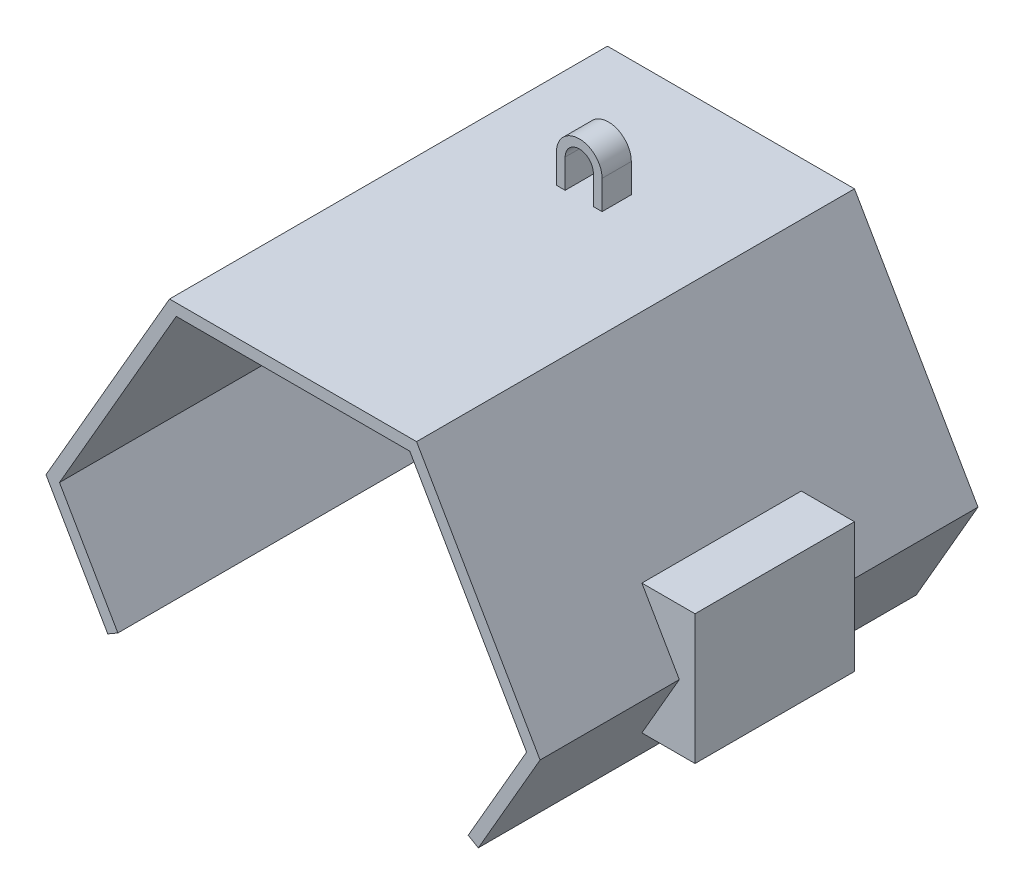
ISO-10303-21;
HEADER;
FILE_DESCRIPTION(('STEP AP214'),'2;1');
FILE_NAME('part.step','',(''),(''),'','','');
FILE_SCHEMA(('AUTOMOTIVE_DESIGN { 1 0 10303 214 1 1 1 1 }'));
ENDSEC;
DATA;
#1=APPLICATION_CONTEXT('core data for automotive mechanical design processes');
#2=APPLICATION_PROTOCOL_DEFINITION('international standard','automotive_design',2000,#1);
#3=PRODUCT_CONTEXT('',#1,'mechanical');
#4=PRODUCT('Part','Part','',(#3));
#5=PRODUCT_RELATED_PRODUCT_CATEGORY('part','',(#4));
#6=PRODUCT_DEFINITION_FORMATION('','',#4);
#7=PRODUCT_DEFINITION_CONTEXT('part definition',#1,'design');
#8=PRODUCT_DEFINITION('design','',#6,#7);
#9=PRODUCT_DEFINITION_SHAPE('','',#8);
#10=(LENGTH_UNIT() NAMED_UNIT(*) SI_UNIT(.MILLI.,.METRE.));
#11=(NAMED_UNIT(*) PLANE_ANGLE_UNIT() SI_UNIT($,.RADIAN.));
#12=(NAMED_UNIT(*) SI_UNIT($,.STERADIAN.) SOLID_ANGLE_UNIT());
#13=UNCERTAINTY_MEASURE_WITH_UNIT(LENGTH_MEASURE(1.E-05),#10,'distance_accuracy_value','');
#14=(GEOMETRIC_REPRESENTATION_CONTEXT(3) GLOBAL_UNCERTAINTY_ASSIGNED_CONTEXT((#13)) GLOBAL_UNIT_ASSIGNED_CONTEXT((#10,
#11,#12)) REPRESENTATION_CONTEXT('',''));
#15=CARTESIAN_POINT('',(0.,0.,0.));
#16=DIRECTION('',(0.,0.,1.));
#17=DIRECTION('',(1.,0.,0.));
#18=AXIS2_PLACEMENT_3D('',#15,#16,#17);
#19=CARTESIAN_POINT('',(-42.3094010767585,73.2820323027551,150.));
#20=DIRECTION('',(0.866025403784439,-0.5,0.));
#21=DIRECTION('',(0.5,0.866025403784439,0.));
#22=AXIS2_PLACEMENT_3D('',#19,#20,#21);
#23=PLANE('',#22);
#24=DIRECTION('',(0.5,0.866025403784439,0.));
#25=VECTOR('',#24,1.);
#26=CARTESIAN_POINT('',(-42.3094010767585,73.2820323027551,102.30182397601));
#27=LINE('',#26,#25);
#28=CARTESIAN_POINT('',(-84.618802153517,0.,102.30182397601));
#29=VERTEX_POINT('',#28);
#30=CARTESIAN_POINT('',(-71.792278819996,22.2161900981261,102.30182397601));
#31=VERTEX_POINT('',#30);
#32=EDGE_CURVE('E330',#29,#31,#27,.T.);
#33=ORIENTED_EDGE('',*,*,#32,.F.);
#34=DIRECTION('',(0.,0.,-1.));
#35=VECTOR('',#34,1.);
#36=CARTESIAN_POINT('',(-84.618802153517,0.,150.));
#37=LINE('',#36,#35);
#38=CARTESIAN_POINT('',(-84.618802153517,0.,150.));
#39=VERTEX_POINT('',#38);
#40=EDGE_CURVE('E40',#39,#29,#37,.T.);
#41=ORIENTED_EDGE('',*,*,#40,.F.);
#42=DIRECTION('',(-0.5,-0.866025403784439,0.));
#43=VECTOR('',#42,1.);
#44=CARTESIAN_POINT('',(-42.3094010767585,73.2820323027551,150.));
#45=LINE('',#44,#43);
#46=CARTESIAN_POINT('',(-42.3094010767585,73.2820323027551,150.));
#47=VERTEX_POINT('',#46);
#48=EDGE_CURVE('E379',#47,#39,#45,.T.);
#49=ORIENTED_EDGE('',*,*,#48,.F.);
#50=DIRECTION('',(0.,0.,-1.));
#51=VECTOR('',#50,1.);
#52=CARTESIAN_POINT('',(-42.3094010767585,73.2820323027551,150.));
#53=LINE('',#52,#51);
#54=CARTESIAN_POINT('',(-42.3094010767585,73.2820323027551,0.));
#55=VERTEX_POINT('',#54);
#56=EDGE_CURVE('E11',#47,#55,#53,.T.);
#57=ORIENTED_EDGE('',*,*,#56,.T.);
#58=DIRECTION('',(-0.5,-0.866025403784439,0.));
#59=VECTOR('',#58,1.);
#60=CARTESIAN_POINT('',(-42.3094010767585,73.2820323027551,0.));
#61=LINE('',#60,#59);
#62=CARTESIAN_POINT('',(-84.618802153517,0.,0.));
#63=VERTEX_POINT('',#62);
#64=EDGE_CURVE('E405',#55,#63,#61,.T.);
#65=ORIENTED_EDGE('',*,*,#64,.T.);
#66=CARTESIAN_POINT('',(-84.618802153517,0.,47.6981760239895));
#67=VERTEX_POINT('',#66);
#68=EDGE_CURVE('E457',#67,#63,#37,.T.);
#69=ORIENTED_EDGE('',*,*,#68,.F.);
#70=DIRECTION('',(-0.5,-0.866025403784439,0.));
#71=VECTOR('',#70,1.);
#72=CARTESIAN_POINT('',(-42.3094010767585,73.2820323027551,47.6981760239896));
#73=LINE('',#72,#71);
#74=CARTESIAN_POINT('',(-71.792278819996,22.2161900981261,47.6981760239895));
#75=VERTEX_POINT('',#74);
#76=EDGE_CURVE('E324',#75,#67,#73,.T.);
#77=ORIENTED_EDGE('',*,*,#76,.F.);
#78=DIRECTION('',(0.,0.,-1.));
#79=VECTOR('',#78,1.);
#80=CARTESIAN_POINT('',(-71.792278819996,22.2161900981261,150.));
#81=LINE('',#80,#79);
#82=EDGE_CURVE('E336',#31,#75,#81,.T.);
#83=ORIENTED_EDGE('',*,*,#82,.F.);
#84=EDGE_LOOP('',(#33,#41,#49,#57,#65,#69,#77,#83));
#85=FACE_BOUND('',#84,.T.);
#86=ADVANCED_FACE('F32',(#85),#23,.F.);
#87=CARTESIAN_POINT('',(-84.618802153517,0.,150.));
#88=DIRECTION('',(0.866025403784438,0.5,0.));
#89=DIRECTION('',(-0.5,0.866025403784439,0.));
#90=AXIS2_PLACEMENT_3D('',#87,#88,#89);
#91=PLANE('',#90);
#92=DIRECTION('',(-0.5,0.866025403784439,0.));
#93=VECTOR('',#92,1.);
#94=CARTESIAN_POINT('',(-84.618802153517,0.,102.30182397601));
#95=LINE('',#94,#93);
#96=CARTESIAN_POINT('',(-71.792278819996,-22.2161900981261,102.30182397601));
#97=VERTEX_POINT('',#96);
#98=EDGE_CURVE('E327',#97,#29,#95,.T.);
#99=ORIENTED_EDGE('',*,*,#98,.F.);
#100=DIRECTION('',(0.,0.,1.));
#101=VECTOR('',#100,1.);
#102=CARTESIAN_POINT('',(-71.792278819996,-22.2161900981261,150.));
#103=LINE('',#102,#101);
#104=CARTESIAN_POINT('',(-71.7922788199959,-22.2161900981261,47.6981760239895));
#105=VERTEX_POINT('',#104);
#106=EDGE_CURVE('E333',#105,#97,#103,.T.);
#107=ORIENTED_EDGE('',*,*,#106,.F.);
#108=DIRECTION('',(0.5,-0.866025403784439,0.));
#109=VECTOR('',#108,1.);
#110=CARTESIAN_POINT('',(-84.618802153517,0.,47.6981760239895));
#111=LINE('',#110,#109);
#112=EDGE_CURVE('E316',#67,#105,#111,.T.);
#113=ORIENTED_EDGE('',*,*,#112,.F.);
#114=ORIENTED_EDGE('',*,*,#68,.T.);
#115=DIRECTION('',(0.5,-0.866025403784438,0.));
#116=VECTOR('',#115,1.);
#117=CARTESIAN_POINT('',(-84.618802153517,0.,0.));
#118=LINE('',#117,#116);
#119=CARTESIAN_POINT('',(-63.4641016151377,-36.6410161513775,0.));
#120=VERTEX_POINT('',#119);
#121=EDGE_CURVE('E408',#63,#120,#118,.T.);
#122=ORIENTED_EDGE('',*,*,#121,.T.);
#123=DIRECTION('',(0.,0.,-1.));
#124=VECTOR('',#123,1.);
#125=CARTESIAN_POINT('',(-63.4641016151377,-36.6410161513775,150.));
#126=LINE('',#125,#124);
#127=CARTESIAN_POINT('',(-63.4641016151377,-36.6410161513775,150.));
#128=VERTEX_POINT('',#127);
#129=EDGE_CURVE('E455',#128,#120,#126,.T.);
#130=ORIENTED_EDGE('',*,*,#129,.F.);
#131=DIRECTION('',(0.5,-0.866025403784438,0.));
#132=VECTOR('',#131,1.);
#133=CARTESIAN_POINT('',(-84.618802153517,0.,150.));
#134=LINE('',#133,#132);
#135=EDGE_CURVE('E382',#39,#128,#134,.T.);
#136=ORIENTED_EDGE('',*,*,#135,.F.);
#137=ORIENTED_EDGE('',*,*,#40,.T.);
#138=EDGE_LOOP('',(#99,#107,#113,#114,#122,#130,#136,#137));
#139=FACE_BOUND('',#138,.T.);
#140=ADVANCED_FACE('F463',(#139),#91,.F.);
#141=CARTESIAN_POINT('',(-80.,0.,150.));
#142=DIRECTION('',(-0.866025403784438,-0.5,0.));
#143=DIRECTION('',(0.5,-0.866025403784439,0.));
#144=AXIS2_PLACEMENT_3D('',#141,#142,#143);
#145=PLANE('',#144);
#146=DIRECTION('',(-0.5,0.866025403784438,0.));
#147=VECTOR('',#146,1.);
#148=CARTESIAN_POINT('',(-80.,0.,0.));
#149=LINE('',#148,#147);
#150=CARTESIAN_POINT('',(-60.,-34.6410161513775,0.));
#151=VERTEX_POINT('',#150);
#152=CARTESIAN_POINT('',(-80.,0.,0.));
#153=VERTEX_POINT('',#152);
#154=EDGE_CURVE('E412',#151,#153,#149,.T.);
#155=ORIENTED_EDGE('',*,*,#154,.T.);
#156=DIRECTION('',(0.,0.,-1.));
#157=VECTOR('',#156,1.);
#158=CARTESIAN_POINT('',(-80.,0.,150.));
#159=LINE('',#158,#157);
#160=CARTESIAN_POINT('',(-80.,0.,150.));
#161=VERTEX_POINT('',#160);
#162=EDGE_CURVE('E450',#161,#153,#159,.T.);
#163=ORIENTED_EDGE('',*,*,#162,.F.);
#164=DIRECTION('',(-0.5,0.866025403784438,0.));
#165=VECTOR('',#164,1.);
#166=CARTESIAN_POINT('',(-80.,0.,150.));
#167=LINE('',#166,#165);
#168=CARTESIAN_POINT('',(-60.,-34.6410161513775,150.));
#169=VERTEX_POINT('',#168);
#170=EDGE_CURVE('E386',#169,#161,#167,.T.);
#171=ORIENTED_EDGE('',*,*,#170,.F.);
#172=DIRECTION('',(0.,0.,-1.));
#173=VECTOR('',#172,1.);
#174=CARTESIAN_POINT('',(-60.,-34.6410161513775,150.));
#175=LINE('',#174,#173);
#176=EDGE_CURVE('E452',#169,#151,#175,.T.);
#177=ORIENTED_EDGE('',*,*,#176,.T.);
#178=EDGE_LOOP('',(#155,#163,#171,#177));
#179=FACE_BOUND('',#178,.T.);
#180=ADVANCED_FACE('F480',(#179),#145,.F.);
#181=CARTESIAN_POINT('',(-40.,69.2820323027551,150.));
#182=DIRECTION('',(-0.866025403784439,0.5,0.));
#183=DIRECTION('',(-0.5,-0.866025403784439,0.));
#184=AXIS2_PLACEMENT_3D('',#181,#182,#183);
#185=PLANE('',#184);
#186=ORIENTED_EDGE('',*,*,#162,.T.);
#187=DIRECTION('',(0.5,0.866025403784439,0.));
#188=VECTOR('',#187,1.);
#189=CARTESIAN_POINT('',(-40.,69.2820323027551,0.));
#190=LINE('',#189,#188);
#191=CARTESIAN_POINT('',(-40.,69.2820323027551,0.));
#192=VERTEX_POINT('',#191);
#193=EDGE_CURVE('E415',#153,#192,#190,.T.);
#194=ORIENTED_EDGE('',*,*,#193,.T.);
#195=DIRECTION('',(0.,0.,-1.));
#196=VECTOR('',#195,1.);
#197=CARTESIAN_POINT('',(-40.,69.2820323027551,150.));
#198=LINE('',#197,#196);
#199=CARTESIAN_POINT('',(-40.,69.2820323027551,150.));
#200=VERTEX_POINT('',#199);
#201=EDGE_CURVE('E447',#200,#192,#198,.T.);
#202=ORIENTED_EDGE('',*,*,#201,.F.);
#203=DIRECTION('',(0.5,0.866025403784439,0.));
#204=VECTOR('',#203,1.);
#205=CARTESIAN_POINT('',(-40.,69.2820323027551,150.));
#206=LINE('',#205,#204);
#207=EDGE_CURVE('E388',#161,#200,#206,.T.);
#208=ORIENTED_EDGE('',*,*,#207,.F.);
#209=EDGE_LOOP('',(#186,#194,#202,#208));
#210=FACE_BOUND('',#209,.T.);
#211=ADVANCED_FACE('F527',(#210),#185,.F.);
#212=CARTESIAN_POINT('',(80.,0.,150.));
#213=DIRECTION('',(0.866025403784438,0.5,0.));
#214=DIRECTION('',(-0.5,0.866025403784439,0.));
#215=AXIS2_PLACEMENT_3D('',#212,#213,#214);
#216=PLANE('',#215);
#217=DIRECTION('',(0.5,-0.866025403784439,0.));
#218=VECTOR('',#217,1.);
#219=CARTESIAN_POINT('',(80.,0.,0.));
#220=LINE('',#219,#218);
#221=CARTESIAN_POINT('',(39.9999999999999,69.2820323027551,0.));
#222=VERTEX_POINT('',#221);
#223=CARTESIAN_POINT('',(80.,0.,0.));
#224=VERTEX_POINT('',#223);
#225=EDGE_CURVE('E419',#222,#224,#220,.T.);
#226=ORIENTED_EDGE('',*,*,#225,.T.);
#227=DIRECTION('',(0.,0.,-1.));
#228=VECTOR('',#227,1.);
#229=CARTESIAN_POINT('',(80.,0.,150.));
#230=LINE('',#229,#228);
#231=CARTESIAN_POINT('',(80.,0.,150.));
#232=VERTEX_POINT('',#231);
#233=EDGE_CURVE('E442',#232,#224,#230,.T.);
#234=ORIENTED_EDGE('',*,*,#233,.F.);
#235=DIRECTION('',(0.5,-0.866025403784439,0.));
#236=VECTOR('',#235,1.);
#237=CARTESIAN_POINT('',(80.,0.,150.));
#238=LINE('',#237,#236);
#239=CARTESIAN_POINT('',(39.9999999999999,69.2820323027551,150.));
#240=VERTEX_POINT('',#239);
#241=EDGE_CURVE('E392',#240,#232,#238,.T.);
#242=ORIENTED_EDGE('',*,*,#241,.F.);
#243=DIRECTION('',(0.,0.,-1.));
#244=VECTOR('',#243,1.);
#245=CARTESIAN_POINT('',(39.9999999999999,69.2820323027551,150.));
#246=LINE('',#245,#244);
#247=EDGE_CURVE('E444',#240,#222,#246,.T.);
#248=ORIENTED_EDGE('',*,*,#247,.T.);
#249=EDGE_LOOP('',(#226,#234,#242,#248));
#250=FACE_BOUND('',#249,.T.);
#251=ADVANCED_FACE('F530',(#250),#216,.F.);
#252=CARTESIAN_POINT('',(60.,-34.6410161513775,150.));
#253=DIRECTION('',(0.866025403784439,-0.5,0.));
#254=DIRECTION('',(0.5,0.866025403784439,0.));
#255=AXIS2_PLACEMENT_3D('',#252,#253,#254);
#256=PLANE('',#255);
#257=ORIENTED_EDGE('',*,*,#233,.T.);
#258=DIRECTION('',(-0.5,-0.866025403784439,0.));
#259=VECTOR('',#258,1.);
#260=CARTESIAN_POINT('',(60.,-34.6410161513775,0.));
#261=LINE('',#260,#259);
#262=CARTESIAN_POINT('',(60.,-34.6410161513775,0.));
#263=VERTEX_POINT('',#262);
#264=EDGE_CURVE('E422',#224,#263,#261,.T.);
#265=ORIENTED_EDGE('',*,*,#264,.T.);
#266=DIRECTION('',(0.,0.,-1.));
#267=VECTOR('',#266,1.);
#268=CARTESIAN_POINT('',(60.,-34.6410161513775,150.));
#269=LINE('',#268,#267);
#270=CARTESIAN_POINT('',(60.,-34.6410161513775,150.));
#271=VERTEX_POINT('',#270);
#272=EDGE_CURVE('E439',#271,#263,#269,.T.);
#273=ORIENTED_EDGE('',*,*,#272,.F.);
#274=DIRECTION('',(-0.5,-0.866025403784439,0.));
#275=VECTOR('',#274,1.);
#276=CARTESIAN_POINT('',(60.,-34.6410161513775,150.));
#277=LINE('',#276,#275);
#278=EDGE_CURVE('E394',#232,#271,#277,.T.);
#279=ORIENTED_EDGE('',*,*,#278,.F.);
#280=EDGE_LOOP('',(#257,#265,#273,#279));
#281=FACE_BOUND('',#280,.T.);
#282=ADVANCED_FACE('F538',(#281),#256,.F.);
#283=CARTESIAN_POINT('',(90.,0.,0.));
#284=DIRECTION('',(1.,0.,0.));
#285=DIRECTION('',(0.,0.,-1.));
#286=AXIS2_PLACEMENT_3D('',#283,#284,#285);
#287=PLANE('',#286);
#288=DIRECTION('',(0.,-1.,0.));
#289=VECTOR('',#288,1.);
#290=CARTESIAN_POINT('',(90.,22.2161900981261,102.30182397601));
#291=LINE('',#290,#289);
#292=CARTESIAN_POINT('',(90.,22.2161900981261,102.30182397601));
#293=VERTEX_POINT('',#292);
#294=CARTESIAN_POINT('',(90.,-22.2161900981261,102.30182397601));
#295=VERTEX_POINT('',#294);
#296=EDGE_CURVE('E364',#293,#295,#291,.T.);
#297=ORIENTED_EDGE('',*,*,#296,.T.);
#298=DIRECTION('',(0.,0.,1.));
#299=VECTOR('',#298,1.);
#300=CARTESIAN_POINT('',(90.,-22.2161900981261,32.8075250499135));
#301=LINE('',#300,#299);
#302=CARTESIAN_POINT('',(90.,-22.2161900981261,47.6981760239895));
#303=VERTEX_POINT('',#302);
#304=EDGE_CURVE('E287',#303,#295,#301,.T.);
#305=ORIENTED_EDGE('',*,*,#304,.F.);
#306=DIRECTION('',(0.,-1.,0.));
#307=VECTOR('',#306,1.);
#308=CARTESIAN_POINT('',(90.,22.2161900981261,47.6981760239895));
#309=LINE('',#308,#307);
#310=CARTESIAN_POINT('',(90.,22.2161900981261,47.6981760239895));
#311=VERTEX_POINT('',#310);
#312=EDGE_CURVE('E361',#311,#303,#309,.T.);
#313=ORIENTED_EDGE('',*,*,#312,.F.);
#314=DIRECTION('',(0.,0.,1.));
#315=VECTOR('',#314,1.);
#316=CARTESIAN_POINT('',(90.,22.2161900981261,102.30182397601));
#317=LINE('',#316,#315);
#318=EDGE_CURVE('E339',#311,#293,#317,.T.);
#319=ORIENTED_EDGE('',*,*,#318,.T.);
#320=EDGE_LOOP('',(#297,#305,#313,#319));
#321=FACE_BOUND('',#320,.T.);
#322=ADVANCED_FACE('F542',(#321),#287,.T.);
#323=CARTESIAN_POINT('',(63.4641016151378,-36.6410161513776,150.));
#324=DIRECTION('',(-0.866025403784439,0.5,0.));
#325=DIRECTION('',(-0.5,-0.866025403784439,0.));
#326=AXIS2_PLACEMENT_3D('',#323,#324,#325);
#327=PLANE('',#326);
#328=DIRECTION('',(-0.5,-0.866025403784439,0.));
#329=VECTOR('',#328,1.);
#330=CARTESIAN_POINT('',(75.2780285621825,-16.178694442189,47.6981760239895));
#331=LINE('',#330,#329);
#332=CARTESIAN_POINT('',(84.618802153517,0.,47.6981760239895));
#333=VERTEX_POINT('',#332);
#334=CARTESIAN_POINT('',(71.792278819996,-22.2161900981261,47.6981760239895));
#335=VERTEX_POINT('',#334);
#336=EDGE_CURVE('E357',#333,#335,#331,.T.);
#337=ORIENTED_EDGE('',*,*,#336,.T.);
#338=DIRECTION('',(0.,0.,-1.));
#339=VECTOR('',#338,1.);
#340=CARTESIAN_POINT('',(71.792278819996,-22.2161900981261,102.30182397601));
#341=LINE('',#340,#339);
#342=CARTESIAN_POINT('',(71.792278819996,-22.2161900981261,102.30182397601));
#343=VERTEX_POINT('',#342);
#344=EDGE_CURVE('E365',#343,#335,#341,.T.);
#345=ORIENTED_EDGE('',*,*,#344,.F.);
#346=DIRECTION('',(-0.5,-0.866025403784439,0.));
#347=VECTOR('',#346,1.);
#348=CARTESIAN_POINT('',(75.2780285621825,-16.178694442189,102.30182397601));
#349=LINE('',#348,#347);
#350=CARTESIAN_POINT('',(84.618802153517,0.,102.30182397601));
#351=VERTEX_POINT('',#350);
#352=EDGE_CURVE('E358',#351,#343,#349,.T.);
#353=ORIENTED_EDGE('',*,*,#352,.F.);
#354=DIRECTION('',(0.,0.,-1.));
#355=VECTOR('',#354,1.);
#356=CARTESIAN_POINT('',(84.618802153517,0.,150.));
#357=LINE('',#356,#355);
#358=CARTESIAN_POINT('',(84.618802153517,0.,150.));
#359=VERTEX_POINT('',#358);
#360=EDGE_CURVE('E433',#359,#351,#357,.T.);
#361=ORIENTED_EDGE('',*,*,#360,.F.);
#362=DIRECTION('',(0.5,0.866025403784439,0.));
#363=VECTOR('',#362,1.);
#364=CARTESIAN_POINT('',(63.4641016151378,-36.6410161513776,150.));
#365=LINE('',#364,#363);
#366=CARTESIAN_POINT('',(63.4641016151378,-36.6410161513776,150.));
#367=VERTEX_POINT('',#366);
#368=EDGE_CURVE('E398',#367,#359,#365,.T.);
#369=ORIENTED_EDGE('',*,*,#368,.F.);
#370=DIRECTION('',(0.,0.,-1.));
#371=VECTOR('',#370,1.);
#372=CARTESIAN_POINT('',(63.4641016151378,-36.6410161513776,150.));
#373=LINE('',#372,#371);
#374=CARTESIAN_POINT('',(63.4641016151378,-36.6410161513776,0.));
#375=VERTEX_POINT('',#374);
#376=EDGE_CURVE('E436',#367,#375,#373,.T.);
#377=ORIENTED_EDGE('',*,*,#376,.T.);
#378=DIRECTION('',(0.5,0.866025403784439,0.));
#379=VECTOR('',#378,1.);
#380=CARTESIAN_POINT('',(63.4641016151378,-36.6410161513776,0.));
#381=LINE('',#380,#379);
#382=CARTESIAN_POINT('',(84.618802153517,0.,0.));
#383=VERTEX_POINT('',#382);
#384=EDGE_CURVE('E426',#375,#383,#381,.T.);
#385=ORIENTED_EDGE('',*,*,#384,.T.);
#386=EDGE_CURVE('E432',#333,#383,#357,.T.);
#387=ORIENTED_EDGE('',*,*,#386,.F.);
#388=EDGE_LOOP('',(#337,#345,#353,#361,#369,#377,#385,#387));
#389=FACE_BOUND('',#388,.T.);
#390=ADVANCED_FACE('F548',(#389),#327,.F.);
#391=CARTESIAN_POINT('',(42.3094010767584,73.2820323027551,150.));
#392=DIRECTION('',(0.,-1.,0.));
#393=DIRECTION('',(1.,0.,0.));
#394=AXIS2_PLACEMENT_3D('',#391,#392,#393);
#395=PLANE('',#394);
#396=DIRECTION('',(0.,0.,1.));
#397=VECTOR('',#396,1.);
#398=CARTESIAN_POINT('',(-9.78911304963503,73.2820323027551,40.));
#399=LINE('',#398,#397);
#400=CARTESIAN_POINT('',(-9.78911304963503,73.2820323027551,40.));
#401=VERTEX_POINT('',#400);
#402=CARTESIAN_POINT('',(-9.78911304963503,73.2820323027551,50.));
#403=VERTEX_POINT('',#402);
#404=EDGE_CURVE('E47',#401,#403,#399,.T.);
#405=ORIENTED_EDGE('',*,*,#404,.F.);
#406=DIRECTION('',(1.,0.,0.));
#407=VECTOR('',#406,1.);
#408=CARTESIAN_POINT('',(-9.78911304963503,73.2820323027551,40.));
#409=LINE('',#408,#407);
#410=CARTESIAN_POINT('',(-6.78911304963503,73.2820323027551,40.));
#411=VERTEX_POINT('',#410);
#412=EDGE_CURVE('E51',#401,#411,#409,.T.);
#413=ORIENTED_EDGE('',*,*,#412,.T.);
#414=DIRECTION('',(0.,0.,1.));
#415=VECTOR('',#414,1.);
#416=CARTESIAN_POINT('',(-6.78911304963503,73.2820323027551,40.));
#417=LINE('',#416,#415);
#418=CARTESIAN_POINT('',(-6.78911304963503,73.2820323027551,50.));
#419=VERTEX_POINT('',#418);
#420=EDGE_CURVE('E238',#411,#419,#417,.T.);
#421=ORIENTED_EDGE('',*,*,#420,.T.);
#422=DIRECTION('',(1.,0.,0.));
#423=VECTOR('',#422,1.);
#424=CARTESIAN_POINT('',(-9.78911304963503,73.2820323027551,50.));
#425=LINE('',#424,#423);
#426=EDGE_CURVE('E266',#403,#419,#425,.T.);
#427=ORIENTED_EDGE('',*,*,#426,.F.);
#428=EDGE_LOOP('',(#405,#413,#421,#427));
#429=FACE_BOUND('',#428,.T.);
#430=DIRECTION('',(0.,0.,1.));
#431=VECTOR('',#430,1.);
#432=CARTESIAN_POINT('',(2.86153035932568,73.2820323027551,40.));
#433=LINE('',#432,#431);
#434=CARTESIAN_POINT('',(2.86153035932568,73.2820323027551,40.));
#435=VERTEX_POINT('',#434);
#436=CARTESIAN_POINT('',(2.86153035932568,73.2820323027551,50.));
#437=VERTEX_POINT('',#436);
#438=EDGE_CURVE('E294',#435,#437,#433,.T.);
#439=ORIENTED_EDGE('',*,*,#438,.F.);
#440=DIRECTION('',(1.,0.,0.));
#441=VECTOR('',#440,1.);
#442=CARTESIAN_POINT('',(5.86153035932568,73.2820323027551,40.));
#443=LINE('',#442,#441);
#444=CARTESIAN_POINT('',(5.86153035932568,73.2820323027551,40.));
#445=VERTEX_POINT('',#444);
#446=EDGE_CURVE('E255',#435,#445,#443,.T.);
#447=ORIENTED_EDGE('',*,*,#446,.T.);
#448=DIRECTION('',(0.,0.,1.));
#449=VECTOR('',#448,1.);
#450=CARTESIAN_POINT('',(5.86153035932568,73.2820323027551,40.));
#451=LINE('',#450,#449);
#452=CARTESIAN_POINT('',(5.86153035932568,73.2820323027551,50.));
#453=VERTEX_POINT('',#452);
#454=EDGE_CURVE('E292',#445,#453,#451,.T.);
#455=ORIENTED_EDGE('',*,*,#454,.T.);
#456=DIRECTION('',(1.,0.,0.));
#457=VECTOR('',#456,1.);
#458=CARTESIAN_POINT('',(5.86153035932568,73.2820323027551,50.));
#459=LINE('',#458,#457);
#460=EDGE_CURVE('E275',#437,#453,#459,.T.);
#461=ORIENTED_EDGE('',*,*,#460,.F.);
#462=EDGE_LOOP('',(#439,#447,#455,#461));
#463=FACE_BOUND('',#462,.T.);
#464=DIRECTION('',(-1.,0.,0.));
#465=VECTOR('',#464,1.);
#466=CARTESIAN_POINT('',(42.3094010767584,73.2820323027551,0.));
#467=LINE('',#466,#465);
#468=CARTESIAN_POINT('',(42.3094010767584,73.2820323027551,0.));
#469=VERTEX_POINT('',#468);
#470=EDGE_CURVE('E373',#469,#55,#467,.T.);
#471=ORIENTED_EDGE('',*,*,#470,.T.);
#472=ORIENTED_EDGE('',*,*,#56,.F.);
#473=DIRECTION('',(-1.,0.,0.));
#474=VECTOR('',#473,1.);
#475=CARTESIAN_POINT('',(42.3094010767584,73.2820323027551,150.));
#476=LINE('',#475,#474);
#477=CARTESIAN_POINT('',(42.3094010767584,73.2820323027551,150.));
#478=VERTEX_POINT('',#477);
#479=EDGE_CURVE('E376',#478,#47,#476,.T.);
#480=ORIENTED_EDGE('',*,*,#479,.F.);
#481=DIRECTION('',(0.,0.,-1.));
#482=VECTOR('',#481,1.);
#483=CARTESIAN_POINT('',(42.3094010767584,73.2820323027551,150.));
#484=LINE('',#483,#482);
#485=EDGE_CURVE('E402',#478,#469,#484,.T.);
#486=ORIENTED_EDGE('',*,*,#485,.T.);
#487=EDGE_LOOP('',(#471,#472,#480,#486));
#488=FACE_BOUND('',#487,.T.);
#489=ADVANCED_FACE('F34',(#429,#463,#488),#395,.F.);
#490=CARTESIAN_POINT('',(-63.4641016151377,-36.6410161513775,150.));
#491=DIRECTION('',(-0.499999999999994,0.866025403784442,0.));
#492=DIRECTION('',(-0.866025403784442,-0.499999999999994,0.));
#493=AXIS2_PLACEMENT_3D('',#490,#491,#492);
#494=PLANE('',#493);
#495=DIRECTION('',(0.866025403784442,0.499999999999994,0.));
#496=VECTOR('',#495,1.);
#497=CARTESIAN_POINT('',(-63.4641016151377,-36.6410161513775,0.));
#498=LINE('',#497,#496);
#499=EDGE_CURVE('E410',#120,#151,#498,.T.);
#500=ORIENTED_EDGE('',*,*,#499,.T.);
#501=ORIENTED_EDGE('',*,*,#176,.F.);
#502=DIRECTION('',(0.866025403784442,0.499999999999994,0.));
#503=VECTOR('',#502,1.);
#504=CARTESIAN_POINT('',(-63.4641016151377,-36.6410161513775,150.));
#505=LINE('',#504,#503);
#506=EDGE_CURVE('E384',#128,#169,#505,.T.);
#507=ORIENTED_EDGE('',*,*,#506,.F.);
#508=ORIENTED_EDGE('',*,*,#129,.T.);
#509=EDGE_LOOP('',(#500,#501,#507,#508));
#510=FACE_BOUND('',#509,.T.);
#511=ADVANCED_FACE('F476',(#510),#494,.F.);
#512=CARTESIAN_POINT('',(39.9999999999999,69.2820323027551,150.));
#513=DIRECTION('',(0.,1.,0.));
#514=DIRECTION('',(-1.,0.,0.));
#515=AXIS2_PLACEMENT_3D('',#512,#513,#514);
#516=PLANE('',#515);
#517=DIRECTION('',(1.,0.,0.));
#518=VECTOR('',#517,1.);
#519=CARTESIAN_POINT('',(39.9999999999999,69.2820323027551,0.));
#520=LINE('',#519,#518);
#521=EDGE_CURVE('E417',#192,#222,#520,.T.);
#522=ORIENTED_EDGE('',*,*,#521,.T.);
#523=ORIENTED_EDGE('',*,*,#247,.F.);
#524=DIRECTION('',(1.,0.,0.));
#525=VECTOR('',#524,1.);
#526=CARTESIAN_POINT('',(39.9999999999999,69.2820323027551,150.));
#527=LINE('',#526,#525);
#528=EDGE_CURVE('E390',#200,#240,#527,.T.);
#529=ORIENTED_EDGE('',*,*,#528,.F.);
#530=ORIENTED_EDGE('',*,*,#201,.T.);
#531=EDGE_LOOP('',(#522,#523,#529,#530));
#532=FACE_BOUND('',#531,.T.);
#533=ADVANCED_FACE('F524',(#532),#516,.F.);
#534=CARTESIAN_POINT('',(63.4641016151378,-36.6410161513776,150.));
#535=DIRECTION('',(0.500000000000003,0.866025403784437,0.));
#536=DIRECTION('',(-0.866025403784437,0.500000000000003,0.));
#537=AXIS2_PLACEMENT_3D('',#534,#535,#536);
#538=PLANE('',#537);
#539=DIRECTION('',(0.866025403784437,-0.500000000000003,0.));
#540=VECTOR('',#539,1.);
#541=CARTESIAN_POINT('',(63.4641016151378,-36.6410161513776,0.));
#542=LINE('',#541,#540);
#543=EDGE_CURVE('E424',#263,#375,#542,.T.);
#544=ORIENTED_EDGE('',*,*,#543,.T.);
#545=ORIENTED_EDGE('',*,*,#376,.F.);
#546=DIRECTION('',(0.866025403784437,-0.500000000000003,0.));
#547=VECTOR('',#546,1.);
#548=CARTESIAN_POINT('',(63.4641016151378,-36.6410161513776,150.));
#549=LINE('',#548,#547);
#550=EDGE_CURVE('E396',#271,#367,#549,.T.);
#551=ORIENTED_EDGE('',*,*,#550,.F.);
#552=ORIENTED_EDGE('',*,*,#272,.T.);
#553=EDGE_LOOP('',(#544,#545,#551,#552));
#554=FACE_BOUND('',#553,.T.);
#555=ADVANCED_FACE('F534',(#554),#538,.F.);
#556=CARTESIAN_POINT('',(84.618802153517,0.,150.));
#557=DIRECTION('',(-0.866025403784438,-0.5,0.));
#558=DIRECTION('',(0.5,-0.866025403784439,0.));
#559=AXIS2_PLACEMENT_3D('',#556,#557,#558);
#560=PLANE('',#559);
#561=ORIENTED_EDGE('',*,*,#360,.T.);
#562=DIRECTION('',(0.5,-0.866025403784439,0.));
#563=VECTOR('',#562,1.);
#564=CARTESIAN_POINT('',(56.0382435619009,49.5029795893782,102.30182397601));
#565=LINE('',#564,#563);
#566=CARTESIAN_POINT('',(71.7922788199959,22.2161900981261,102.30182397601));
#567=VERTEX_POINT('',#566);
#568=EDGE_CURVE('E347',#567,#351,#565,.T.);
#569=ORIENTED_EDGE('',*,*,#568,.F.);
#570=DIRECTION('',(0.,0.,1.));
#571=VECTOR('',#570,1.);
#572=CARTESIAN_POINT('',(71.7922788199959,22.2161900981261,102.30182397601));
#573=LINE('',#572,#571);
#574=CARTESIAN_POINT('',(71.792278819996,22.2161900981261,47.6981760239895));
#575=VERTEX_POINT('',#574);
#576=EDGE_CURVE('E342',#575,#567,#573,.T.);
#577=ORIENTED_EDGE('',*,*,#576,.F.);
#578=DIRECTION('',(-0.5,0.866025403784439,0.));
#579=VECTOR('',#578,1.);
#580=CARTESIAN_POINT('',(56.0382435619009,49.5029795893782,47.6981760239895));
#581=LINE('',#580,#579);
#582=EDGE_CURVE('E343',#333,#575,#581,.T.);
#583=ORIENTED_EDGE('',*,*,#582,.F.);
#584=ORIENTED_EDGE('',*,*,#386,.T.);
#585=DIRECTION('',(-0.5,0.866025403784439,0.));
#586=VECTOR('',#585,1.);
#587=CARTESIAN_POINT('',(84.618802153517,0.,0.));
#588=LINE('',#587,#586);
#589=EDGE_CURVE('E380',#383,#469,#588,.T.);
#590=ORIENTED_EDGE('',*,*,#589,.T.);
#591=ORIENTED_EDGE('',*,*,#485,.F.);
#592=DIRECTION('',(-0.5,0.866025403784439,0.));
#593=VECTOR('',#592,1.);
#594=CARTESIAN_POINT('',(84.618802153517,0.,150.));
#595=LINE('',#594,#593);
#596=EDGE_CURVE('E400',#359,#478,#595,.T.);
#597=ORIENTED_EDGE('',*,*,#596,.F.);
#598=EDGE_LOOP('',(#561,#569,#577,#583,#584,#590,#591,#597));
#599=FACE_BOUND('',#598,.T.);
#600=ADVANCED_FACE('F546',(#599),#560,.F.);
#601=CARTESIAN_POINT('',(0.,0.,150.));
#602=DIRECTION('',(0.,0.,1.));
#603=DIRECTION('',(1.,0.,0.));
#604=AXIS2_PLACEMENT_3D('',#601,#602,#603);
#605=PLANE('',#604);
#606=ORIENTED_EDGE('',*,*,#479,.T.);
#607=ORIENTED_EDGE('',*,*,#48,.T.);
#608=ORIENTED_EDGE('',*,*,#135,.T.);
#609=ORIENTED_EDGE('',*,*,#506,.T.);
#610=ORIENTED_EDGE('',*,*,#170,.T.);
#611=ORIENTED_EDGE('',*,*,#207,.T.);
#612=ORIENTED_EDGE('',*,*,#528,.T.);
#613=ORIENTED_EDGE('',*,*,#241,.T.);
#614=ORIENTED_EDGE('',*,*,#278,.T.);
#615=ORIENTED_EDGE('',*,*,#550,.T.);
#616=ORIENTED_EDGE('',*,*,#368,.T.);
#617=ORIENTED_EDGE('',*,*,#596,.T.);
#618=EDGE_LOOP('',(#606,#607,#608,#609,#610,#611,#612,#613,#614,#615,#616,#617));
#619=FACE_BOUND('',#618,.T.);
#620=ADVANCED_FACE('F484',(#619),#605,.T.);
#621=CARTESIAN_POINT('',(0.,0.,0.));
#622=DIRECTION('',(0.,0.,1.));
#623=DIRECTION('',(1.,0.,0.));
#624=AXIS2_PLACEMENT_3D('',#621,#622,#623);
#625=PLANE('',#624);
#626=ORIENTED_EDGE('',*,*,#470,.F.);
#627=ORIENTED_EDGE('',*,*,#589,.F.);
#628=ORIENTED_EDGE('',*,*,#384,.F.);
#629=ORIENTED_EDGE('',*,*,#543,.F.);
#630=ORIENTED_EDGE('',*,*,#264,.F.);
#631=ORIENTED_EDGE('',*,*,#225,.F.);
#632=ORIENTED_EDGE('',*,*,#521,.F.);
#633=ORIENTED_EDGE('',*,*,#193,.F.);
#634=ORIENTED_EDGE('',*,*,#154,.F.);
#635=ORIENTED_EDGE('',*,*,#499,.F.);
#636=ORIENTED_EDGE('',*,*,#121,.F.);
#637=ORIENTED_EDGE('',*,*,#64,.F.);
#638=EDGE_LOOP('',(#626,#627,#628,#629,#630,#631,#632,#633,#634,#635,#636,#637));
#639=FACE_BOUND('',#638,.T.);
#640=ADVANCED_FACE('F471',(#639),#625,.F.);
#641=CARTESIAN_POINT('',(8.77613778761585,-22.2161900981261,102.30182397601));
#642=DIRECTION('',(0.,-1.,0.));
#643=DIRECTION('',(0.,0.,-1.));
#644=AXIS2_PLACEMENT_3D('',#641,#642,#643);
#645=PLANE('',#644);
#646=ORIENTED_EDGE('',*,*,#304,.T.);
#647=DIRECTION('',(1.,0.,0.));
#648=VECTOR('',#647,1.);
#649=CARTESIAN_POINT('',(8.77613778761585,-22.2161900981261,102.30182397601));
#650=LINE('',#649,#648);
#651=EDGE_CURVE('E360',#343,#295,#650,.T.);
#652=ORIENTED_EDGE('',*,*,#651,.F.);
#653=ORIENTED_EDGE('',*,*,#344,.T.);
#654=DIRECTION('',(1.,0.,0.));
#655=VECTOR('',#654,1.);
#656=CARTESIAN_POINT('',(8.77613778761585,-22.2161900981261,47.6981760239895));
#657=LINE('',#656,#655);
#658=EDGE_CURVE('E368',#335,#303,#657,.T.);
#659=ORIENTED_EDGE('',*,*,#658,.T.);
#660=EDGE_LOOP('',(#646,#652,#653,#659));
#661=FACE_BOUND('',#660,.T.);
#662=ADVANCED_FACE('F557',(#661),#645,.T.);
#663=CARTESIAN_POINT('',(8.77613778761585,22.2161900981261,47.6981760239895));
#664=DIRECTION('',(0.,0.,1.));
#665=DIRECTION('',(0.,-1.,0.));
#666=AXIS2_PLACEMENT_3D('',#663,#664,#665);
#667=PLANE('',#666);
#668=ORIENTED_EDGE('',*,*,#312,.T.);
#669=ORIENTED_EDGE('',*,*,#658,.F.);
#670=ORIENTED_EDGE('',*,*,#336,.F.);
#671=ORIENTED_EDGE('',*,*,#582,.T.);
#672=DIRECTION('',(1.,0.,0.));
#673=VECTOR('',#672,1.);
#674=CARTESIAN_POINT('',(8.77613778761582,22.2161900981261,47.6981760239895));
#675=LINE('',#674,#673);
#676=EDGE_CURVE('E346',#575,#311,#675,.T.);
#677=ORIENTED_EDGE('',*,*,#676,.T.);
#678=EDGE_LOOP('',(#668,#669,#670,#671,#677));
#679=FACE_BOUND('',#678,.T.);
#680=ADVANCED_FACE('F565',(#679),#667,.F.);
#681=CARTESIAN_POINT('',(8.77613778761585,22.2161900981261,102.30182397601));
#682=DIRECTION('',(0.,0.,1.));
#683=DIRECTION('',(1.,0.,0.));
#684=AXIS2_PLACEMENT_3D('',#681,#682,#683);
#685=PLANE('',#684);
#686=ORIENTED_EDGE('',*,*,#651,.T.);
#687=ORIENTED_EDGE('',*,*,#296,.F.);
#688=DIRECTION('',(1.,0.,0.));
#689=VECTOR('',#688,1.);
#690=CARTESIAN_POINT('',(8.77613778761582,22.2161900981261,102.30182397601));
#691=LINE('',#690,#689);
#692=EDGE_CURVE('E350',#567,#293,#691,.T.);
#693=ORIENTED_EDGE('',*,*,#692,.F.);
#694=ORIENTED_EDGE('',*,*,#568,.T.);
#695=ORIENTED_EDGE('',*,*,#352,.T.);
#696=EDGE_LOOP('',(#686,#687,#693,#694,#695));
#697=FACE_BOUND('',#696,.T.);
#698=ADVANCED_FACE('F569',(#697),#685,.T.);
#699=CARTESIAN_POINT('',(8.77613778761582,22.2161900981261,102.30182397601));
#700=DIRECTION('',(0.,1.,0.));
#701=DIRECTION('',(0.,0.,1.));
#702=AXIS2_PLACEMENT_3D('',#699,#700,#701);
#703=PLANE('',#702);
#704=ORIENTED_EDGE('',*,*,#676,.F.);
#705=ORIENTED_EDGE('',*,*,#576,.T.);
#706=ORIENTED_EDGE('',*,*,#692,.T.);
#707=ORIENTED_EDGE('',*,*,#318,.F.);
#708=EDGE_LOOP('',(#704,#705,#706,#707));
#709=FACE_BOUND('',#708,.T.);
#710=ADVANCED_FACE('F572',(#709),#703,.T.);
#711=CARTESIAN_POINT('',(160.461466519418,22.2161900981261,102.30182397601));
#712=DIRECTION('',(0.,-1.,0.));
#713=DIRECTION('',(0.,0.,-1.));
#714=AXIS2_PLACEMENT_3D('',#711,#712,#713);
#715=PLANE('',#714);
#716=DIRECTION('',(-1.,0.,0.));
#717=VECTOR('',#716,1.);
#718=CARTESIAN_POINT('',(160.461466519418,22.2161900981261,102.30182397601));
#719=LINE('',#718,#717);
#720=CARTESIAN_POINT('',(-90.,22.2161900981261,102.30182397601));
#721=VERTEX_POINT('',#720);
#722=EDGE_CURVE('E317',#31,#721,#719,.T.);
#723=ORIENTED_EDGE('',*,*,#722,.F.);
#724=ORIENTED_EDGE('',*,*,#82,.T.);
#725=DIRECTION('',(-1.,0.,0.));
#726=VECTOR('',#725,1.);
#727=CARTESIAN_POINT('',(160.461466519418,22.2161900981261,47.6981760239895));
#728=LINE('',#727,#726);
#729=CARTESIAN_POINT('',(-90.,22.2161900981261,47.6981760239895));
#730=VERTEX_POINT('',#729);
#731=EDGE_CURVE('E314',#75,#730,#728,.T.);
#732=ORIENTED_EDGE('',*,*,#731,.T.);
#733=DIRECTION('',(0.,0.,1.));
#734=VECTOR('',#733,1.);
#735=CARTESIAN_POINT('',(-90.,22.2161900981261,102.30182397601));
#736=LINE('',#735,#734);
#737=EDGE_CURVE('E310',#730,#721,#736,.T.);
#738=ORIENTED_EDGE('',*,*,#737,.T.);
#739=EDGE_LOOP('',(#723,#724,#732,#738));
#740=FACE_BOUND('',#739,.T.);
#741=ADVANCED_FACE('F492',(#740),#715,.F.);
#742=CARTESIAN_POINT('',(160.461466519418,-22.2161900981261,102.30182397601));
#743=DIRECTION('',(0.,1.,0.));
#744=DIRECTION('',(0.,0.,1.));
#745=AXIS2_PLACEMENT_3D('',#742,#743,#744);
#746=PLANE('',#745);
#747=DIRECTION('',(-1.,0.,0.));
#748=VECTOR('',#747,1.);
#749=CARTESIAN_POINT('',(160.461466519418,-22.2161900981261,47.6981760239895));
#750=LINE('',#749,#748);
#751=CARTESIAN_POINT('',(-90.,-22.2161900981261,47.6981760239895));
#752=VERTEX_POINT('',#751);
#753=EDGE_CURVE('E313',#105,#752,#750,.T.);
#754=ORIENTED_EDGE('',*,*,#753,.F.);
#755=ORIENTED_EDGE('',*,*,#106,.T.);
#756=DIRECTION('',(-1.,0.,0.));
#757=VECTOR('',#756,1.);
#758=CARTESIAN_POINT('',(160.461466519418,-22.2161900981261,102.30182397601));
#759=LINE('',#758,#757);
#760=CARTESIAN_POINT('',(-90.,-22.2161900981261,102.30182397601));
#761=VERTEX_POINT('',#760);
#762=EDGE_CURVE('E319',#97,#761,#759,.T.);
#763=ORIENTED_EDGE('',*,*,#762,.T.);
#764=DIRECTION('',(0.,0.,-1.));
#765=VECTOR('',#764,1.);
#766=CARTESIAN_POINT('',(-90.,-22.2161900981261,102.30182397601));
#767=LINE('',#766,#765);
#768=EDGE_CURVE('E304',#761,#752,#767,.T.);
#769=ORIENTED_EDGE('',*,*,#768,.T.);
#770=EDGE_LOOP('',(#754,#755,#763,#769));
#771=FACE_BOUND('',#770,.T.);
#772=ADVANCED_FACE('F502',(#771),#746,.F.);
#773=CARTESIAN_POINT('',(160.461466519418,22.2161900981261,102.30182397601));
#774=DIRECTION('',(0.,0.,-1.));
#775=DIRECTION('',(-1.,0.,0.));
#776=AXIS2_PLACEMENT_3D('',#773,#774,#775);
#777=PLANE('',#776);
#778=ORIENTED_EDGE('',*,*,#98,.T.);
#779=ORIENTED_EDGE('',*,*,#32,.T.);
#780=ORIENTED_EDGE('',*,*,#722,.T.);
#781=DIRECTION('',(0.,-1.,0.));
#782=VECTOR('',#781,1.);
#783=CARTESIAN_POINT('',(-90.,22.2161900981261,102.30182397601));
#784=LINE('',#783,#782);
#785=EDGE_CURVE('E307',#721,#761,#784,.T.);
#786=ORIENTED_EDGE('',*,*,#785,.T.);
#787=ORIENTED_EDGE('',*,*,#762,.F.);
#788=EDGE_LOOP('',(#778,#779,#780,#786,#787));
#789=FACE_BOUND('',#788,.T.);
#790=ADVANCED_FACE('F489',(#789),#777,.F.);
#791=CARTESIAN_POINT('',(160.461466519418,22.2161900981261,47.6981760239895));
#792=DIRECTION('',(0.,0.,1.));
#793=DIRECTION('',(0.,-1.,0.));
#794=AXIS2_PLACEMENT_3D('',#791,#792,#793);
#795=PLANE('',#794);
#796=ORIENTED_EDGE('',*,*,#731,.F.);
#797=ORIENTED_EDGE('',*,*,#76,.T.);
#798=ORIENTED_EDGE('',*,*,#112,.T.);
#799=ORIENTED_EDGE('',*,*,#753,.T.);
#800=DIRECTION('',(0.,1.,0.));
#801=VECTOR('',#800,1.);
#802=CARTESIAN_POINT('',(-90.,22.2161900981261,47.6981760239895));
#803=LINE('',#802,#801);
#804=EDGE_CURVE('E301',#752,#730,#803,.T.);
#805=ORIENTED_EDGE('',*,*,#804,.T.);
#806=EDGE_LOOP('',(#796,#797,#798,#799,#805));
#807=FACE_BOUND('',#806,.T.);
#808=ADVANCED_FACE('F504',(#807),#795,.F.);
#809=CARTESIAN_POINT('',(-90.,0.,0.));
#810=DIRECTION('',(-1.,0.,0.));
#811=DIRECTION('',(0.,0.,-1.));
#812=AXIS2_PLACEMENT_3D('',#809,#810,#811);
#813=PLANE('',#812);
#814=ORIENTED_EDGE('',*,*,#804,.F.);
#815=ORIENTED_EDGE('',*,*,#768,.F.);
#816=ORIENTED_EDGE('',*,*,#785,.F.);
#817=ORIENTED_EDGE('',*,*,#737,.F.);
#818=EDGE_LOOP('',(#814,#815,#816,#817));
#819=FACE_BOUND('',#818,.T.);
#820=ADVANCED_FACE('F499',(#819),#813,.T.);
#821=CARTESIAN_POINT('',(-9.78911304963503,73.2820323027551,40.));
#822=DIRECTION('',(-1.,0.,0.));
#823=DIRECTION('',(0.,0.,1.));
#824=AXIS2_PLACEMENT_3D('',#821,#822,#823);
#825=PLANE('',#824);
#826=DIRECTION('',(0.,-1.,0.));
#827=VECTOR('',#826,1.);
#828=CARTESIAN_POINT('',(-9.78911304963503,73.2820323027551,50.));
#829=LINE('',#828,#827);
#830=CARTESIAN_POINT('',(-9.78911304963503,83.1567621885938,50.));
#831=VERTEX_POINT('',#830);
#832=EDGE_CURVE('E251',#831,#403,#829,.T.);
#833=ORIENTED_EDGE('',*,*,#832,.F.);
#834=DIRECTION('',(0.,0.,1.));
#835=VECTOR('',#834,1.);
#836=CARTESIAN_POINT('',(-9.78911304963503,83.1567621885938,40.));
#837=LINE('',#836,#835);
#838=CARTESIAN_POINT('',(-9.78911304963503,83.1567621885938,40.));
#839=VERTEX_POINT('',#838);
#840=EDGE_CURVE('E288',#839,#831,#837,.T.);
#841=ORIENTED_EDGE('',*,*,#840,.F.);
#842=DIRECTION('',(0.,-1.,0.));
#843=VECTOR('',#842,1.);
#844=CARTESIAN_POINT('',(-9.78911304963503,73.2820323027551,40.));
#845=LINE('',#844,#843);
#846=EDGE_CURVE('E263',#839,#401,#845,.T.);
#847=ORIENTED_EDGE('',*,*,#846,.T.);
#848=ORIENTED_EDGE('',*,*,#404,.T.);
#849=EDGE_LOOP('',(#833,#841,#847,#848));
#850=FACE_BOUND('',#849,.T.);
#851=ADVANCED_FACE('F511',(#850),#825,.T.);
#852=CARTESIAN_POINT('',(-1.96379134515468,83.1567621885938,40.));
#853=DIRECTION('',(0.,0.,1.));
#854=DIRECTION('',(1.,0.,0.));
#855=AXIS2_PLACEMENT_3D('',#852,#853,#854);
#856=CYLINDRICAL_SURFACE('',#855,7.82532170448036);
#857=CARTESIAN_POINT('',(-1.96379134515468,83.1567621885938,50.));
#858=DIRECTION('',(0.,0.,1.));
#859=DIRECTION('',(-1.,0.,0.));
#860=AXIS2_PLACEMENT_3D('',#857,#858,#859);
#861=CIRCLE('',#860,7.82532170448036);
#862=CARTESIAN_POINT('',(5.86153035932568,83.1567621885938,50.));
#863=VERTEX_POINT('',#862);
#864=EDGE_CURVE('E281',#863,#831,#861,.T.);
#865=ORIENTED_EDGE('',*,*,#864,.F.);
#866=DIRECTION('',(0.,0.,1.));
#867=VECTOR('',#866,1.);
#868=CARTESIAN_POINT('',(5.86153035932568,83.1567621885938,40.));
#869=LINE('',#868,#867);
#870=CARTESIAN_POINT('',(5.86153035932568,83.1567621885938,40.));
#871=VERTEX_POINT('',#870);
#872=EDGE_CURVE('E290',#871,#863,#869,.T.);
#873=ORIENTED_EDGE('',*,*,#872,.F.);
#874=CARTESIAN_POINT('',(-1.96379134515468,83.1567621885938,40.));
#875=DIRECTION('',(0.,0.,1.));
#876=DIRECTION('',(-1.,0.,0.));
#877=AXIS2_PLACEMENT_3D('',#874,#875,#876);
#878=CIRCLE('',#877,7.82532170448036);
#879=EDGE_CURVE('E260',#871,#839,#878,.T.);
#880=ORIENTED_EDGE('',*,*,#879,.T.);
#881=ORIENTED_EDGE('',*,*,#840,.T.);
#882=EDGE_LOOP('',(#865,#873,#880,#881));
#883=FACE_BOUND('',#882,.T.);
#884=ADVANCED_FACE('F617',(#883),#856,.T.);
#885=CARTESIAN_POINT('',(5.86153035932568,83.1567621885938,40.));
#886=DIRECTION('',(1.,0.,0.));
#887=DIRECTION('',(0.,0.,-1.));
#888=AXIS2_PLACEMENT_3D('',#885,#886,#887);
#889=PLANE('',#888);
#890=DIRECTION('',(0.,1.,0.));
#891=VECTOR('',#890,1.);
#892=CARTESIAN_POINT('',(5.86153035932568,83.1567621885938,50.));
#893=LINE('',#892,#891);
#894=EDGE_CURVE('E278',#453,#863,#893,.T.);
#895=ORIENTED_EDGE('',*,*,#894,.F.);
#896=ORIENTED_EDGE('',*,*,#454,.F.);
#897=DIRECTION('',(0.,1.,0.));
#898=VECTOR('',#897,1.);
#899=CARTESIAN_POINT('',(5.86153035932568,83.1567621885938,40.));
#900=LINE('',#899,#898);
#901=EDGE_CURVE('E257',#445,#871,#900,.T.);
#902=ORIENTED_EDGE('',*,*,#901,.T.);
#903=ORIENTED_EDGE('',*,*,#872,.T.);
#904=EDGE_LOOP('',(#895,#896,#902,#903));
#905=FACE_BOUND('',#904,.T.);
#906=ADVANCED_FACE('F615',(#905),#889,.T.);
#907=CARTESIAN_POINT('',(2.86153035932568,83.1567621885938,40.));
#908=DIRECTION('',(-1.,0.,0.));
#909=DIRECTION('',(0.,0.,1.));
#910=AXIS2_PLACEMENT_3D('',#907,#908,#909);
#911=PLANE('',#910);
#912=DIRECTION('',(0.,-1.,0.));
#913=VECTOR('',#912,1.);
#914=CARTESIAN_POINT('',(2.86153035932568,83.1567621885938,50.));
#915=LINE('',#914,#913);
#916=CARTESIAN_POINT('',(2.86153035932568,83.1567621885938,50.));
#917=VERTEX_POINT('',#916);
#918=EDGE_CURVE('E272',#917,#437,#915,.T.);
#919=ORIENTED_EDGE('',*,*,#918,.F.);
#920=DIRECTION('',(0.,0.,1.));
#921=VECTOR('',#920,1.);
#922=CARTESIAN_POINT('',(2.86153035932568,83.1567621885938,40.));
#923=LINE('',#922,#921);
#924=CARTESIAN_POINT('',(2.86153035932568,83.1567621885938,40.));
#925=VERTEX_POINT('',#924);
#926=EDGE_CURVE('E237',#925,#917,#923,.T.);
#927=ORIENTED_EDGE('',*,*,#926,.F.);
#928=DIRECTION('',(0.,-1.,0.));
#929=VECTOR('',#928,1.);
#930=CARTESIAN_POINT('',(2.86153035932568,83.1567621885938,40.));
#931=LINE('',#930,#929);
#932=EDGE_CURVE('E247',#925,#435,#931,.T.);
#933=ORIENTED_EDGE('',*,*,#932,.T.);
#934=ORIENTED_EDGE('',*,*,#438,.T.);
#935=EDGE_LOOP('',(#919,#927,#933,#934));
#936=FACE_BOUND('',#935,.T.);
#937=ADVANCED_FACE('F606',(#936),#911,.T.);
#938=CARTESIAN_POINT('',(-1.96379134515468,83.1567621885938,40.));
#939=DIRECTION('',(0.,0.,1.));
#940=DIRECTION('',(1.,0.,0.));
#941=AXIS2_PLACEMENT_3D('',#938,#939,#940);
#942=CYLINDRICAL_SURFACE('',#941,4.82532170448036);
#943=CARTESIAN_POINT('',(-1.96379134515468,83.1567621885938,50.));
#944=DIRECTION('',(0.,0.,-1.));
#945=DIRECTION('',(-1.,0.,0.));
#946=AXIS2_PLACEMENT_3D('',#943,#944,#945);
#947=CIRCLE('',#946,4.82532170448036);
#948=CARTESIAN_POINT('',(-6.78911304963503,83.1567621885938,50.));
#949=VERTEX_POINT('',#948);
#950=EDGE_CURVE('E232',#949,#917,#947,.T.);
#951=ORIENTED_EDGE('',*,*,#950,.F.);
#952=DIRECTION('',(0.,0.,1.));
#953=VECTOR('',#952,1.);
#954=CARTESIAN_POINT('',(-6.78911304963503,83.1567621885938,40.));
#955=LINE('',#954,#953);
#956=CARTESIAN_POINT('',(-6.78911304963503,83.1567621885938,40.));
#957=VERTEX_POINT('',#956);
#958=EDGE_CURVE('E227',#957,#949,#955,.T.);
#959=ORIENTED_EDGE('',*,*,#958,.F.);
#960=CARTESIAN_POINT('',(-1.96379134515468,83.1567621885938,40.));
#961=DIRECTION('',(0.,0.,-1.));
#962=DIRECTION('',(-1.,0.,0.));
#963=AXIS2_PLACEMENT_3D('',#960,#961,#962);
#964=CIRCLE('',#963,4.82532170448036);
#965=EDGE_CURVE('E230',#957,#925,#964,.T.);
#966=ORIENTED_EDGE('',*,*,#965,.T.);
#967=ORIENTED_EDGE('',*,*,#926,.T.);
#968=EDGE_LOOP('',(#951,#959,#966,#967));
#969=FACE_BOUND('',#968,.T.);
#970=ADVANCED_FACE('F229',(#969),#942,.F.);
#971=CARTESIAN_POINT('',(-6.78911304963503,73.2820323027551,40.));
#972=DIRECTION('',(1.,0.,0.));
#973=DIRECTION('',(0.,0.,-1.));
#974=AXIS2_PLACEMENT_3D('',#971,#972,#973);
#975=PLANE('',#974);
#976=DIRECTION('',(0.,1.,0.));
#977=VECTOR('',#976,1.);
#978=CARTESIAN_POINT('',(-6.78911304963503,73.2820323027551,50.));
#979=LINE('',#978,#977);
#980=EDGE_CURVE('E269',#419,#949,#979,.T.);
#981=ORIENTED_EDGE('',*,*,#980,.F.);
#982=ORIENTED_EDGE('',*,*,#420,.F.);
#983=DIRECTION('',(0.,1.,0.));
#984=VECTOR('',#983,1.);
#985=CARTESIAN_POINT('',(-6.78911304963503,73.2820323027551,40.));
#986=LINE('',#985,#984);
#987=EDGE_CURVE('E244',#411,#957,#986,.T.);
#988=ORIENTED_EDGE('',*,*,#987,.T.);
#989=ORIENTED_EDGE('',*,*,#958,.T.);
#990=EDGE_LOOP('',(#981,#982,#988,#989));
#991=FACE_BOUND('',#990,.T.);
#992=ADVANCED_FACE('F249',(#991),#975,.T.);
#993=CARTESIAN_POINT('',(-1.96379134515468,83.1567621885938,40.));
#994=DIRECTION('',(0.,0.,-1.));
#995=DIRECTION('',(-1.,0.,0.));
#996=AXIS2_PLACEMENT_3D('',#993,#994,#995);
#997=PLANE('',#996);
#998=ORIENTED_EDGE('',*,*,#412,.F.);
#999=ORIENTED_EDGE('',*,*,#846,.F.);
#1000=ORIENTED_EDGE('',*,*,#879,.F.);
#1001=ORIENTED_EDGE('',*,*,#901,.F.);
#1002=ORIENTED_EDGE('',*,*,#446,.F.);
#1003=ORIENTED_EDGE('',*,*,#932,.F.);
#1004=ORIENTED_EDGE('',*,*,#965,.F.);
#1005=ORIENTED_EDGE('',*,*,#987,.F.);
#1006=EDGE_LOOP('',(#998,#999,#1000,#1001,#1002,#1003,#1004,#1005));
#1007=FACE_BOUND('',#1006,.T.);
#1008=ADVANCED_FACE('F243',(#1007),#997,.T.);
#1009=CARTESIAN_POINT('',(-1.96379134515468,83.1567621885938,50.));
#1010=DIRECTION('',(0.,0.,-1.));
#1011=DIRECTION('',(-1.,0.,0.));
#1012=AXIS2_PLACEMENT_3D('',#1009,#1010,#1011);
#1013=PLANE('',#1012);
#1014=ORIENTED_EDGE('',*,*,#426,.T.);
#1015=ORIENTED_EDGE('',*,*,#980,.T.);
#1016=ORIENTED_EDGE('',*,*,#950,.T.);
#1017=ORIENTED_EDGE('',*,*,#918,.T.);
#1018=ORIENTED_EDGE('',*,*,#460,.T.);
#1019=ORIENTED_EDGE('',*,*,#894,.T.);
#1020=ORIENTED_EDGE('',*,*,#864,.T.);
#1021=ORIENTED_EDGE('',*,*,#832,.T.);
#1022=EDGE_LOOP('',(#1014,#1015,#1016,#1017,#1018,#1019,#1020,#1021));
#1023=FACE_BOUND('',#1022,.T.);
#1024=ADVANCED_FACE('F608',(#1023),#1013,.F.);
#1025=CLOSED_SHELL('',(#86,#140,#180,#211,#251,#282,#322,#390,#489,#511,#533,#555,#600,#620,
#640,#662,#680,#698,#710,#741,#772,#790,#808,#820,#851,#884,#906,#937,#970,#992,#1008,#1024));
#1026=MANIFOLD_SOLID_BREP('B2',#1025);
#1027=ADVANCED_BREP_SHAPE_REPRESENTATION('',(#18,#1026),#14);
#1028=SHAPE_DEFINITION_REPRESENTATION(#9,#1027);
ENDSEC;
END-ISO-10303-21;
